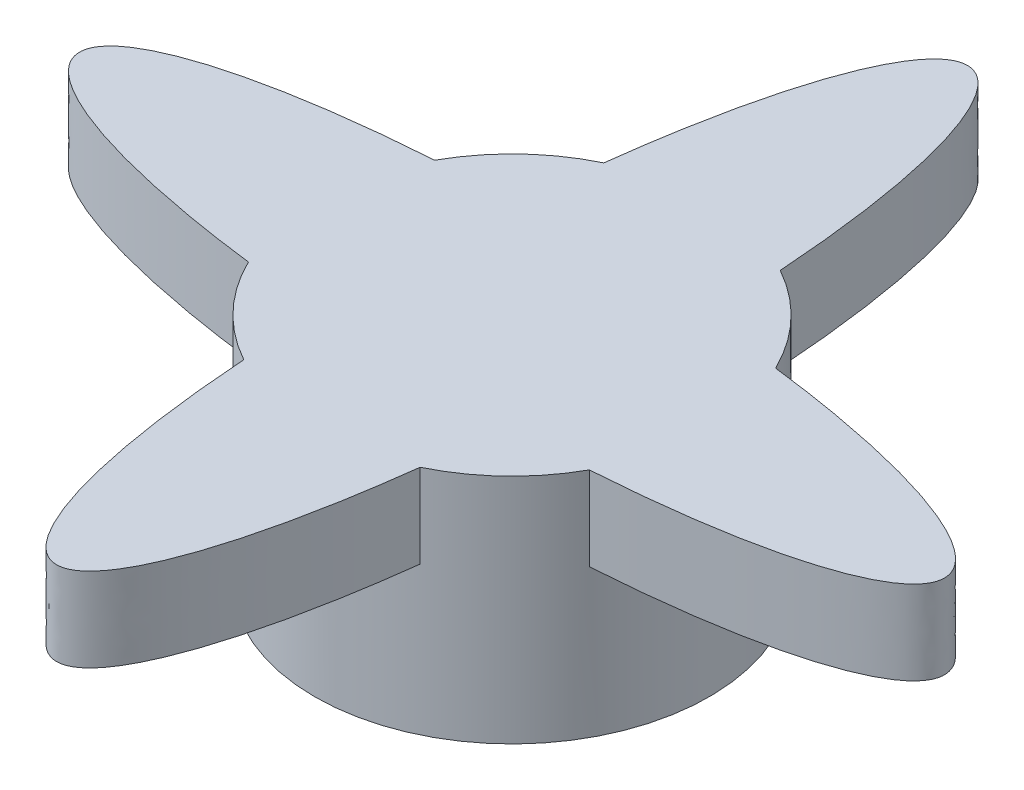
ISO-10303-21;
HEADER;
FILE_DESCRIPTION(('STEP AP214'),'2;1');
FILE_NAME('part.step','',(''),(''),'','','');
FILE_SCHEMA(('AUTOMOTIVE_DESIGN { 1 0 10303 214 1 1 1 1 }'));
ENDSEC;
DATA;
#1=APPLICATION_CONTEXT('core data for automotive mechanical design processes');
#2=APPLICATION_PROTOCOL_DEFINITION('international standard','automotive_design',2000,#1);
#3=PRODUCT_CONTEXT('',#1,'mechanical');
#4=PRODUCT('Part','Part','',(#3));
#5=PRODUCT_RELATED_PRODUCT_CATEGORY('part','',(#4));
#6=PRODUCT_DEFINITION_FORMATION('','',#4);
#7=PRODUCT_DEFINITION_CONTEXT('part definition',#1,'design');
#8=PRODUCT_DEFINITION('design','',#6,#7);
#9=PRODUCT_DEFINITION_SHAPE('','',#8);
#10=(LENGTH_UNIT() NAMED_UNIT(*) SI_UNIT(.MILLI.,.METRE.));
#11=(NAMED_UNIT(*) PLANE_ANGLE_UNIT() SI_UNIT($,.RADIAN.));
#12=(NAMED_UNIT(*) SI_UNIT($,.STERADIAN.) SOLID_ANGLE_UNIT());
#13=UNCERTAINTY_MEASURE_WITH_UNIT(LENGTH_MEASURE(1.E-05),#10,'distance_accuracy_value','');
#14=(GEOMETRIC_REPRESENTATION_CONTEXT(3) GLOBAL_UNCERTAINTY_ASSIGNED_CONTEXT((#13)) GLOBAL_UNIT_ASSIGNED_CONTEXT((#10,
#11,#12)) REPRESENTATION_CONTEXT('',''));
#15=CARTESIAN_POINT('',(0.,0.,0.));
#16=DIRECTION('',(0.,0.,1.));
#17=DIRECTION('',(1.,0.,0.));
#18=AXIS2_PLACEMENT_3D('',#15,#16,#17);
#19=CARTESIAN_POINT('',(0.,0.,0.));
#20=DIRECTION('',(0.,1.,0.));
#21=DIRECTION('',(0.,0.,1.));
#22=AXIS2_PLACEMENT_3D('',#19,#20,#21);
#23=PLANE('',#22);
#24=CARTESIAN_POINT('',(0.,0.,0.));
#25=DIRECTION('',(0.,1.,0.));
#26=DIRECTION('',(0.,0.,1.));
#27=AXIS2_PLACEMENT_3D('',#24,#25,#26);
#28=CIRCLE('',#27,4.);
#29=CARTESIAN_POINT('',(0.,0.,4.));
#30=VERTEX_POINT('',#29);
#31=EDGE_CURVE('E76',#30,#30,#28,.T.);
#32=ORIENTED_EDGE('',*,*,#31,.F.);
#33=EDGE_LOOP('',(#32));
#34=FACE_BOUND('',#33,.T.);
#35=CARTESIAN_POINT('',(0.,0.,0.));
#36=DIRECTION('',(0.,1.,0.));
#37=DIRECTION('',(0.,0.,1.));
#38=AXIS2_PLACEMENT_3D('',#35,#36,#37);
#39=CIRCLE('',#38,2.5);
#40=CARTESIAN_POINT('',(0.,0.,2.5));
#41=VERTEX_POINT('',#40);
#42=EDGE_CURVE('E229',#41,#41,#39,.T.);
#43=ORIENTED_EDGE('',*,*,#42,.T.);
#44=EDGE_LOOP('',(#43));
#45=FACE_BOUND('',#44,.T.);
#46=ADVANCED_FACE('F72',(#34,#45),#23,.F.);
#47=CARTESIAN_POINT('',(0.,3.,0.));
#48=DIRECTION('',(0.,-1.,0.));
#49=DIRECTION('',(0.,0.,-1.));
#50=AXIS2_PLACEMENT_3D('',#47,#48,#49);
#51=CYLINDRICAL_SURFACE('',#50,4.);
#52=CARTESIAN_POINT('',(0.,3.,0.));
#53=DIRECTION('',(0.,1.,0.));
#54=DIRECTION('',(0.,0.,1.));
#55=AXIS2_PLACEMENT_3D('',#52,#53,#54);
#56=CIRCLE('',#55,4.);
#57=CARTESIAN_POINT('',(3.50141524472229,3.,1.93393156136053));
#58=VERTEX_POINT('',#57);
#59=CARTESIAN_POINT('',(3.60181115415465,3.,-1.73981505046));
#60=VERTEX_POINT('',#59);
#61=EDGE_CURVE('E12',#58,#60,#56,.T.);
#62=ORIENTED_EDGE('',*,*,#61,.F.);
#63=DIRECTION('',(0.,-1.,0.));
#64=VECTOR('',#63,1.);
#65=CARTESIAN_POINT('',(3.50141524472229,4.7,1.93393156136053));
#66=LINE('',#65,#64);
#67=CARTESIAN_POINT('',(3.50141524472229,4.7,1.93393156136053));
#68=VERTEX_POINT('',#67);
#69=EDGE_CURVE('E137',#68,#58,#66,.T.);
#70=ORIENTED_EDGE('',*,*,#69,.F.);
#71=CARTESIAN_POINT('',(0.,4.7,0.));
#72=DIRECTION('',(0.,1.,0.));
#73=DIRECTION('',(0.,0.,1.));
#74=AXIS2_PLACEMENT_3D('',#71,#72,#73);
#75=CIRCLE('',#74,4.);
#76=CARTESIAN_POINT('',(1.73981505046,4.7,3.60181115415465));
#77=VERTEX_POINT('',#76);
#78=EDGE_CURVE('E140',#77,#68,#75,.T.);
#79=ORIENTED_EDGE('',*,*,#78,.F.);
#80=DIRECTION('',(0.,-1.,0.));
#81=VECTOR('',#80,1.);
#82=CARTESIAN_POINT('',(1.73981505046,4.7,3.60181115415465));
#83=LINE('',#82,#81);
#84=CARTESIAN_POINT('',(1.73981505046,3.,3.60181115415465));
#85=VERTEX_POINT('',#84);
#86=EDGE_CURVE('E210',#77,#85,#83,.T.);
#87=ORIENTED_EDGE('',*,*,#86,.T.);
#88=CARTESIAN_POINT('',(-1.93393156136053,3.,3.50141524472229));
#89=VERTEX_POINT('',#88);
#90=EDGE_CURVE('E82',#89,#85,#56,.T.);
#91=ORIENTED_EDGE('',*,*,#90,.F.);
#92=DIRECTION('',(0.,-1.,0.));
#93=VECTOR('',#92,1.);
#94=CARTESIAN_POINT('',(-1.93393156136053,4.7,3.50141524472229));
#95=LINE('',#94,#93);
#96=CARTESIAN_POINT('',(-1.93393156136053,4.7,3.50141524472229));
#97=VERTEX_POINT('',#96);
#98=EDGE_CURVE('E204',#97,#89,#95,.T.);
#99=ORIENTED_EDGE('',*,*,#98,.F.);
#100=CARTESIAN_POINT('',(-3.60181115415465,4.7,1.73981505046));
#101=VERTEX_POINT('',#100);
#102=EDGE_CURVE('E159',#101,#97,#75,.T.);
#103=ORIENTED_EDGE('',*,*,#102,.F.);
#104=DIRECTION('',(0.,-1.,0.));
#105=VECTOR('',#104,1.);
#106=CARTESIAN_POINT('',(-3.60181115415465,4.7,1.73981505046));
#107=LINE('',#106,#105);
#108=CARTESIAN_POINT('',(-3.60181115415465,3.,1.73981505046));
#109=VERTEX_POINT('',#108);
#110=EDGE_CURVE('E200',#101,#109,#107,.T.);
#111=ORIENTED_EDGE('',*,*,#110,.T.);
#112=CARTESIAN_POINT('',(-3.50141524472229,3.,-1.93393156136053));
#113=VERTEX_POINT('',#112);
#114=EDGE_CURVE('E95',#113,#109,#56,.T.);
#115=ORIENTED_EDGE('',*,*,#114,.F.);
#116=DIRECTION('',(0.,-1.,0.));
#117=VECTOR('',#116,1.);
#118=CARTESIAN_POINT('',(-3.50141524472229,4.7,-1.93393156136053));
#119=LINE('',#118,#117);
#120=CARTESIAN_POINT('',(-3.50141524472229,4.7,-1.93393156136053));
#121=VERTEX_POINT('',#120);
#122=EDGE_CURVE('E192',#121,#113,#119,.T.);
#123=ORIENTED_EDGE('',*,*,#122,.F.);
#124=CARTESIAN_POINT('',(-1.73981505046,4.7,-3.60181115415465));
#125=VERTEX_POINT('',#124);
#126=EDGE_CURVE('E242',#125,#121,#75,.T.);
#127=ORIENTED_EDGE('',*,*,#126,.F.);
#128=DIRECTION('',(0.,-1.,0.));
#129=VECTOR('',#128,1.);
#130=CARTESIAN_POINT('',(-1.73981505046,4.7,-3.60181115415465));
#131=LINE('',#130,#129);
#132=CARTESIAN_POINT('',(-1.73981505046,3.,-3.60181115415465));
#133=VERTEX_POINT('',#132);
#134=EDGE_CURVE('E188',#125,#133,#131,.T.);
#135=ORIENTED_EDGE('',*,*,#134,.T.);
#136=CARTESIAN_POINT('',(1.93393156136053,3.,-3.50141524472229));
#137=VERTEX_POINT('',#136);
#138=EDGE_CURVE('E81',#137,#133,#56,.T.);
#139=ORIENTED_EDGE('',*,*,#138,.F.);
#140=DIRECTION('',(0.,-1.,0.));
#141=VECTOR('',#140,1.);
#142=CARTESIAN_POINT('',(1.93393156136053,4.7,-3.50141524472229));
#143=LINE('',#142,#141);
#144=CARTESIAN_POINT('',(1.93393156136053,4.7,-3.50141524472229));
#145=VERTEX_POINT('',#144);
#146=EDGE_CURVE('E165',#145,#137,#143,.T.);
#147=ORIENTED_EDGE('',*,*,#146,.F.);
#148=CARTESIAN_POINT('',(3.60181115415465,4.7,-1.73981505046));
#149=VERTEX_POINT('',#148);
#150=EDGE_CURVE('E157',#149,#145,#75,.T.);
#151=ORIENTED_EDGE('',*,*,#150,.F.);
#152=DIRECTION('',(0.,-1.,0.));
#153=VECTOR('',#152,1.);
#154=CARTESIAN_POINT('',(3.60181115415465,4.7,-1.73981505046));
#155=LINE('',#154,#153);
#156=EDGE_CURVE('E148',#149,#60,#155,.T.);
#157=ORIENTED_EDGE('',*,*,#156,.T.);
#158=EDGE_LOOP('',(#62,#70,#79,#87,#91,#99,#103,#111,#115,#123,#127,#135,#139,#147,#151,#157));
#159=FACE_BOUND('',#158,.T.);
#160=ORIENTED_EDGE('',*,*,#31,.T.);
#161=EDGE_LOOP('',(#160));
#162=FACE_BOUND('',#161,.T.);
#163=ADVANCED_FACE('F74',(#159,#162),#51,.T.);
#164=CARTESIAN_POINT('',(0.,3.,0.));
#165=DIRECTION('',(0.,-1.,0.));
#166=DIRECTION('',(0.,0.,-1.));
#167=AXIS2_PLACEMENT_3D('',#164,#165,#166);
#168=CYLINDRICAL_SURFACE('',#167,2.5);
#169=CARTESIAN_POINT('',(0.,3.,0.));
#170=DIRECTION('',(0.,1.,0.));
#171=DIRECTION('',(0.,0.,1.));
#172=AXIS2_PLACEMENT_3D('',#169,#170,#171);
#173=CIRCLE('',#172,2.5);
#174=CARTESIAN_POINT('',(0.,3.,2.5));
#175=VERTEX_POINT('',#174);
#176=EDGE_CURVE('E147',#175,#175,#173,.T.);
#177=ORIENTED_EDGE('',*,*,#176,.T.);
#178=EDGE_LOOP('',(#177));
#179=FACE_BOUND('',#178,.T.);
#180=ORIENTED_EDGE('',*,*,#42,.F.);
#181=EDGE_LOOP('',(#180));
#182=FACE_BOUND('',#181,.T.);
#183=ADVANCED_FACE('F215',(#179,#182),#168,.F.);
#184=CARTESIAN_POINT('',(0.,3.,0.));
#185=DIRECTION('',(0.,1.,0.));
#186=DIRECTION('',(0.,0.,1.));
#187=AXIS2_PLACEMENT_3D('',#184,#185,#186);
#188=PLANE('',#187);
#189=ORIENTED_EDGE('',*,*,#176,.F.);
#190=EDGE_LOOP('',(#189));
#191=FACE_BOUND('',#190,.T.);
#192=ADVANCED_FACE('F217',(#191),#188,.F.);
#193=CARTESIAN_POINT('',(0.,3.,0.));
#194=DIRECTION('',(0.,1.,0.));
#195=DIRECTION('',(-0.99962680099848,0.,-0.02731773646454));
#196=AXIS2_PLACEMENT_3D('',#193,#194,#195);
#197=ELLIPSE('',#196,9.,2.);
#198=EDGE_CURVE('E162',#58,#60,#197,.T.);
#199=ORIENTED_EDGE('',*,*,#198,.F.);
#200=ORIENTED_EDGE('',*,*,#61,.T.);
#201=EDGE_LOOP('',(#199,#200));
#202=FACE_BOUND('',#201,.T.);
#203=ADVANCED_FACE('F247',(#202),#188,.F.);
#204=CARTESIAN_POINT('',(0.,3.,0.));
#205=DIRECTION('',(0.,1.,0.));
#206=DIRECTION('',(0.0273177364645401,0.,-0.99962680099848));
#207=AXIS2_PLACEMENT_3D('',#204,#205,#206);
#208=ELLIPSE('',#207,9.,2.);
#209=EDGE_CURVE('E189',#137,#133,#208,.T.);
#210=ORIENTED_EDGE('',*,*,#209,.F.);
#211=ORIENTED_EDGE('',*,*,#138,.T.);
#212=EDGE_LOOP('',(#210,#211));
#213=FACE_BOUND('',#212,.T.);
#214=ADVANCED_FACE('F238',(#213),#188,.F.);
#215=CARTESIAN_POINT('',(0.,3.,0.));
#216=DIRECTION('',(0.,1.,0.));
#217=DIRECTION('',(-0.99962680099848,0.,-0.02731773646454));
#218=AXIS2_PLACEMENT_3D('',#215,#216,#217);
#219=ELLIPSE('',#218,9.,2.);
#220=EDGE_CURVE('E201',#113,#109,#219,.T.);
#221=ORIENTED_EDGE('',*,*,#220,.F.);
#222=ORIENTED_EDGE('',*,*,#114,.T.);
#223=EDGE_LOOP('',(#221,#222));
#224=FACE_BOUND('',#223,.T.);
#225=ADVANCED_FACE('F173',(#224),#188,.F.);
#226=CARTESIAN_POINT('',(0.,4.7,0.));
#227=DIRECTION('',(0.,1.,0.));
#228=DIRECTION('',(-0.99962680099848,0.,-0.02731773646454));
#229=AXIS2_PLACEMENT_3D('',#226,#227,#228);
#230=ELLIPSE('',#229,9.,2.);
#231=DIRECTION('',(0.,-1.,0.));
#232=VECTOR('',#231,1.);
#233=SURFACE_OF_LINEAR_EXTRUSION('',#230,#232);
#234=ORIENTED_EDGE('',*,*,#198,.T.);
#235=ORIENTED_EDGE('',*,*,#156,.F.);
#236=EDGE_CURVE('E153',#68,#149,#230,.T.);
#237=ORIENTED_EDGE('',*,*,#236,.F.);
#238=ORIENTED_EDGE('',*,*,#69,.T.);
#239=EDGE_LOOP('',(#234,#235,#237,#238));
#240=FACE_BOUND('',#239,.T.);
#241=ADVANCED_FACE('F160',(#240),#233,.F.);
#242=CARTESIAN_POINT('',(0.,3.,0.));
#243=DIRECTION('',(0.,1.,0.));
#244=DIRECTION('',(0.0273177364645401,0.,-0.99962680099848));
#245=AXIS2_PLACEMENT_3D('',#242,#243,#244);
#246=ELLIPSE('',#245,9.,2.);
#247=EDGE_CURVE('E156',#89,#85,#246,.T.);
#248=ORIENTED_EDGE('',*,*,#247,.F.);
#249=ORIENTED_EDGE('',*,*,#90,.T.);
#250=EDGE_LOOP('',(#248,#249));
#251=FACE_BOUND('',#250,.T.);
#252=ADVANCED_FACE('F172',(#251),#188,.F.);
#253=CARTESIAN_POINT('',(0.,4.7,0.));
#254=DIRECTION('',(0.,1.,0.));
#255=DIRECTION('',(0.,0.,1.));
#256=AXIS2_PLACEMENT_3D('',#253,#254,#255);
#257=PLANE('',#256);
#258=ORIENTED_EDGE('',*,*,#236,.T.);
#259=ORIENTED_EDGE('',*,*,#150,.T.);
#260=CARTESIAN_POINT('',(0.,4.7,0.));
#261=DIRECTION('',(0.,1.,0.));
#262=DIRECTION('',(0.0273177364645401,0.,-0.99962680099848));
#263=AXIS2_PLACEMENT_3D('',#260,#261,#262);
#264=ELLIPSE('',#263,9.,2.);
#265=EDGE_CURVE('E184',#145,#125,#264,.T.);
#266=ORIENTED_EDGE('',*,*,#265,.T.);
#267=ORIENTED_EDGE('',*,*,#126,.T.);
#268=CARTESIAN_POINT('',(0.,4.7,0.));
#269=DIRECTION('',(0.,1.,0.));
#270=DIRECTION('',(-0.99962680099848,0.,-0.02731773646454));
#271=AXIS2_PLACEMENT_3D('',#268,#269,#270);
#272=ELLIPSE('',#271,9.,2.);
#273=EDGE_CURVE('E196',#121,#101,#272,.T.);
#274=ORIENTED_EDGE('',*,*,#273,.T.);
#275=ORIENTED_EDGE('',*,*,#102,.T.);
#276=CARTESIAN_POINT('',(0.,4.7,0.));
#277=DIRECTION('',(0.,1.,0.));
#278=DIRECTION('',(0.0273177364645401,0.,-0.99962680099848));
#279=AXIS2_PLACEMENT_3D('',#276,#277,#278);
#280=ELLIPSE('',#279,9.,2.);
#281=EDGE_CURVE('E155',#97,#77,#280,.T.);
#282=ORIENTED_EDGE('',*,*,#281,.T.);
#283=ORIENTED_EDGE('',*,*,#78,.T.);
#284=EDGE_LOOP('',(#258,#259,#266,#267,#274,#275,#282,#283));
#285=FACE_BOUND('',#284,.T.);
#286=ADVANCED_FACE('F152',(#285),#257,.T.);
#287=DIRECTION('',(0.,-1.,0.));
#288=VECTOR('',#287,1.);
#289=SURFACE_OF_LINEAR_EXTRUSION('',#272,#288);
#290=ORIENTED_EDGE('',*,*,#220,.T.);
#291=ORIENTED_EDGE('',*,*,#110,.F.);
#292=ORIENTED_EDGE('',*,*,#273,.F.);
#293=ORIENTED_EDGE('',*,*,#122,.T.);
#294=EDGE_LOOP('',(#290,#291,#292,#293));
#295=FACE_BOUND('',#294,.T.);
#296=ADVANCED_FACE('F181',(#295),#289,.F.);
#297=DIRECTION('',(0.,-1.,0.));
#298=VECTOR('',#297,1.);
#299=SURFACE_OF_LINEAR_EXTRUSION('',#280,#298);
#300=ORIENTED_EDGE('',*,*,#247,.T.);
#301=ORIENTED_EDGE('',*,*,#86,.F.);
#302=ORIENTED_EDGE('',*,*,#281,.F.);
#303=ORIENTED_EDGE('',*,*,#98,.T.);
#304=EDGE_LOOP('',(#300,#301,#302,#303));
#305=FACE_BOUND('',#304,.T.);
#306=ADVANCED_FACE('F179',(#305),#299,.F.);
#307=DIRECTION('',(0.,-1.,0.));
#308=VECTOR('',#307,1.);
#309=SURFACE_OF_LINEAR_EXTRUSION('',#264,#308);
#310=ORIENTED_EDGE('',*,*,#209,.T.);
#311=ORIENTED_EDGE('',*,*,#134,.F.);
#312=ORIENTED_EDGE('',*,*,#265,.F.);
#313=ORIENTED_EDGE('',*,*,#146,.T.);
#314=EDGE_LOOP('',(#310,#311,#312,#313));
#315=FACE_BOUND('',#314,.T.);
#316=ADVANCED_FACE('F175',(#315),#309,.F.);
#317=CLOSED_SHELL('',(#46,#163,#183,#192,#203,#214,#225,#241,#252,#286,#296,#306,#316));
#318=MANIFOLD_SOLID_BREP('B2',#317);
#319=ADVANCED_BREP_SHAPE_REPRESENTATION('',(#18,#318),#14);
#320=SHAPE_DEFINITION_REPRESENTATION(#9,#319);
ENDSEC;
END-ISO-10303-21;
